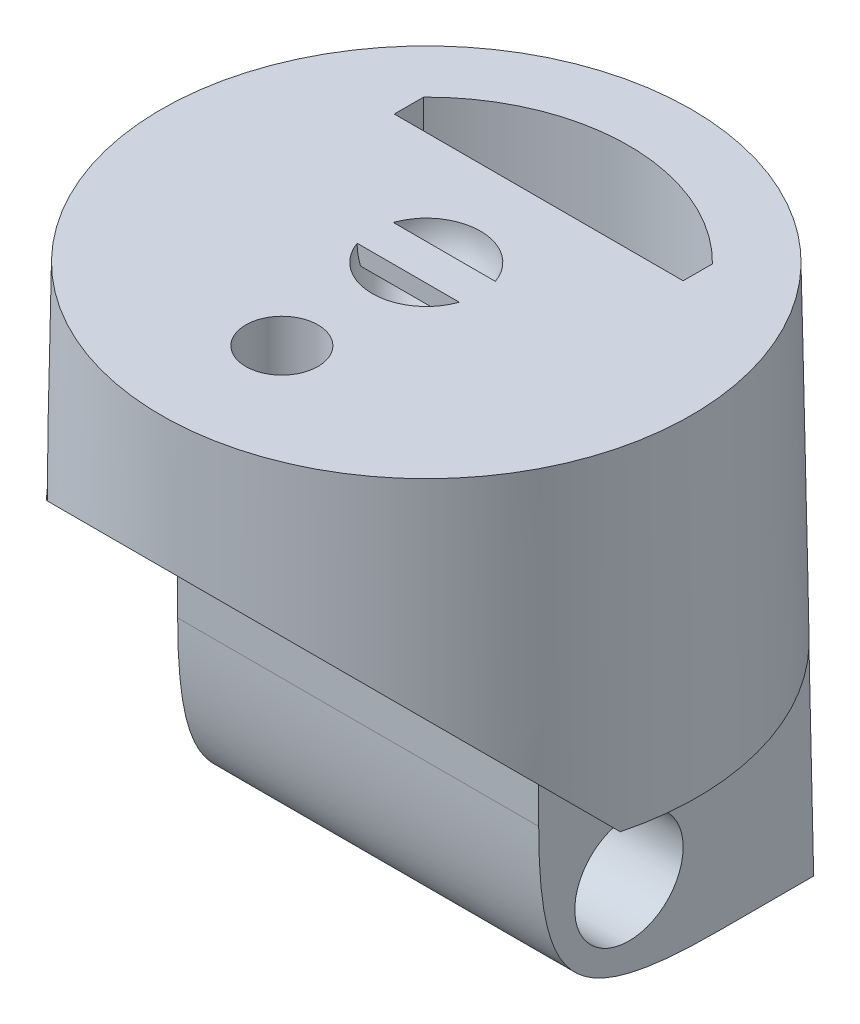
ISO-10303-21;
HEADER;
FILE_DESCRIPTION(('STEP AP214'),'2;1');
FILE_NAME('part.step','',(''),(''),'','','');
FILE_SCHEMA(('AUTOMOTIVE_DESIGN { 1 0 10303 214 1 1 1 1 }'));
ENDSEC;
DATA;
#1=APPLICATION_CONTEXT('core data for automotive mechanical design processes');
#2=APPLICATION_PROTOCOL_DEFINITION('international standard','automotive_design',2000,#1);
#3=PRODUCT_CONTEXT('',#1,'mechanical');
#4=PRODUCT('Part','Part','',(#3));
#5=PRODUCT_RELATED_PRODUCT_CATEGORY('part','',(#4));
#6=PRODUCT_DEFINITION_FORMATION('','',#4);
#7=PRODUCT_DEFINITION_CONTEXT('part definition',#1,'design');
#8=PRODUCT_DEFINITION('design','',#6,#7);
#9=PRODUCT_DEFINITION_SHAPE('','',#8);
#10=(LENGTH_UNIT() NAMED_UNIT(*) SI_UNIT(.MILLI.,.METRE.));
#11=(NAMED_UNIT(*) PLANE_ANGLE_UNIT() SI_UNIT($,.RADIAN.));
#12=(NAMED_UNIT(*) SI_UNIT($,.STERADIAN.) SOLID_ANGLE_UNIT());
#13=UNCERTAINTY_MEASURE_WITH_UNIT(LENGTH_MEASURE(1.E-05),#10,'distance_accuracy_value','');
#14=(GEOMETRIC_REPRESENTATION_CONTEXT(3) GLOBAL_UNCERTAINTY_ASSIGNED_CONTEXT((#13)) GLOBAL_UNIT_ASSIGNED_CONTEXT((#10,
#11,#12)) REPRESENTATION_CONTEXT('',''));
#15=CARTESIAN_POINT('',(0.,0.,0.));
#16=DIRECTION('',(0.,0.,1.));
#17=DIRECTION('',(1.,0.,0.));
#18=AXIS2_PLACEMENT_3D('',#15,#16,#17);
#19=CARTESIAN_POINT('',(0.,9.08726369937621,0.));
#20=DIRECTION('',(-1.,0.,0.));
#21=DIRECTION('',(0.,0.,-1.));
#22=AXIS2_PLACEMENT_3D('',#19,#20,#21);
#23=SPHERICAL_SURFACE('',#22,1.5);
#24=CARTESIAN_POINT('',(0.,8.58726369937621,0.));
#25=DIRECTION('',(0.,1.,0.));
#26=DIRECTION('',(0.,0.,1.));
#27=AXIS2_PLACEMENT_3D('',#24,#25,#26);
#28=CIRCLE('',#27,1.4142135623731);
#29=CARTESIAN_POINT('',(1.3228756555323,8.58726369937621,0.5));
#30=VERTEX_POINT('',#29);
#31=CARTESIAN_POINT('',(1.3228756555323,8.58726369937621,-0.5));
#32=VERTEX_POINT('',#31);
#33=EDGE_CURVE('E67',#30,#32,#28,.T.);
#34=ORIENTED_EDGE('',*,*,#33,.T.);
#35=CARTESIAN_POINT('',(0.,9.08726369937621,-0.5));
#36=DIRECTION('',(0.,0.,1.));
#37=DIRECTION('',(1.,0.,0.));
#38=AXIS2_PLACEMENT_3D('',#35,#36,#37);
#39=CIRCLE('',#38,1.4142135623731);
#40=CARTESIAN_POINT('',(1.4142135623731,9.08726369937621,-0.5));
#41=VERTEX_POINT('',#40);
#42=EDGE_CURVE('E13',#32,#41,#39,.T.);
#43=ORIENTED_EDGE('',*,*,#42,.T.);
#44=CARTESIAN_POINT('',(0.,9.08726369937621,0.));
#45=DIRECTION('',(0.,-1.,0.));
#46=DIRECTION('',(0.,0.,-1.));
#47=AXIS2_PLACEMENT_3D('',#44,#45,#46);
#48=CIRCLE('',#47,1.5);
#49=CARTESIAN_POINT('',(-1.4142135623731,9.08726369937621,-0.5));
#50=VERTEX_POINT('',#49);
#51=EDGE_CURVE('E157',#41,#50,#48,.F.);
#52=ORIENTED_EDGE('',*,*,#51,.T.);
#53=CARTESIAN_POINT('',(-1.3228756555323,8.58726369937621,-0.5));
#54=VERTEX_POINT('',#53);
#55=EDGE_CURVE('E56',#50,#54,#39,.T.);
#56=ORIENTED_EDGE('',*,*,#55,.T.);
#57=CARTESIAN_POINT('',(-1.3228756555323,8.58726369937621,0.5));
#58=VERTEX_POINT('',#57);
#59=EDGE_CURVE('E162',#54,#58,#28,.T.);
#60=ORIENTED_EDGE('',*,*,#59,.T.);
#61=CARTESIAN_POINT('',(0.,9.08726369937621,0.5));
#62=DIRECTION('',(0.,0.,1.));
#63=DIRECTION('',(1.,0.,0.));
#64=AXIS2_PLACEMENT_3D('',#61,#62,#63);
#65=CIRCLE('',#64,1.4142135623731);
#66=CARTESIAN_POINT('',(-1.4142135623731,9.08726369937621,0.5));
#67=VERTEX_POINT('',#66);
#68=EDGE_CURVE('E160',#67,#58,#65,.T.);
#69=ORIENTED_EDGE('',*,*,#68,.F.);
#70=CARTESIAN_POINT('',(1.4142135623731,9.08726369937621,0.5));
#71=VERTEX_POINT('',#70);
#72=EDGE_CURVE('E150',#67,#71,#48,.F.);
#73=ORIENTED_EDGE('',*,*,#72,.T.);
#74=EDGE_CURVE('E61',#30,#71,#65,.T.);
#75=ORIENTED_EDGE('',*,*,#74,.F.);
#76=EDGE_LOOP('',(#34,#43,#52,#56,#60,#69,#73,#75));
#77=FACE_BOUND('',#76,.T.);
#78=ADVANCED_FACE('F48',(#77),#23,.F.);
#79=CARTESIAN_POINT('',(0.,0.,0.));
#80=DIRECTION('',(0.,-1.,0.));
#81=DIRECTION('',(0.,0.,1.));
#82=AXIS2_PLACEMENT_3D('',#79,#80,#81);
#83=CONICAL_SURFACE('',#82,7.5,0.0174532925199434);
#84=CARTESIAN_POINT('',(0.,9.08726369937621,0.));
#85=DIRECTION('',(0.,-1.,0.));
#86=DIRECTION('',(0.,0.,-1.));
#87=AXIS2_PLACEMENT_3D('',#84,#85,#86);
#88=CIRCLE('',#87,7.34138122210755);
#89=CARTESIAN_POINT('',(0.,9.08726369937621,-7.34138122210755));
#90=VERTEX_POINT('',#89);
#91=EDGE_CURVE('E198',#90,#90,#88,.F.);
#92=ORIENTED_EDGE('',*,*,#91,.F.);
#93=EDGE_LOOP('',(#92));
#94=FACE_BOUND('',#93,.T.);
#95=CARTESIAN_POINT('',(0.,0.,0.));
#96=DIRECTION('',(0.,1.,0.));
#97=DIRECTION('',(0.,0.,1.));
#98=AXIS2_PLACEMENT_3D('',#95,#96,#97);
#99=CIRCLE('',#98,7.5);
#100=CARTESIAN_POINT('',(5.,0.,-5.59016994374948));
#101=VERTEX_POINT('',#100);
#102=CARTESIAN_POINT('',(7.25897968705128,0.,1.88605776766695));
#103=VERTEX_POINT('',#102);
#104=EDGE_CURVE('E489',#101,#103,#99,.F.);
#105=ORIENTED_EDGE('',*,*,#104,.F.);
#106=CARTESIAN_POINT('',(5.,10.3775407591745,-5.34468916009784));
#107=CARTESIAN_POINT('',(5.,7.89530710809119,-5.40401868693817));
#108=CARTESIAN_POINT('',(5.,5.41306256433035,-5.46289130191557));
#109=CARTESIAN_POINT('',(5.,0.448553998900634,-5.57979955803964));
#110=CARTESIAN_POINT('',(5.,-2.03371002276637,-5.63783519926591));
#111=CARTESIAN_POINT('',(5.,-6.99825566920806,-5.7531463681212));
#112=CARTESIAN_POINT('',(5.,-9.48053729398247,-5.81042189576228));
#113=CARTESIAN_POINT('',(5.,-14.445116775284,-5.92427558863006));
#114=CARTESIAN_POINT('',(5.,-16.9274146318126,-5.98085375379047));
#115=CARTESIAN_POINT('',(5.,-19.4097196629107,-6.03711460739748));
#116=B_SPLINE_CURVE_WITH_KNOTS('',3,(#106,#107,#108,#109,#110,#111,#112,#113,#114,#115),
.UNSPECIFIED.,.F.,.F.,(4,2,2,2,4),(0.,7.44882767880741,14.8976546493633,22.3464815017265,
29.795309062088),.UNSPECIFIED.);
#117=CARTESIAN_POINT('',(5.,-6.,-5.72991485958028));
#118=VERTEX_POINT('',#117);
#119=EDGE_CURVE('E379',#101,#118,#116,.T.);
#120=ORIENTED_EDGE('',*,*,#119,.T.);
#121=CARTESIAN_POINT('',(0.,-6.,0.));
#122=DIRECTION('',(0.,1.,0.));
#123=DIRECTION('',(0.,0.,1.));
#124=AXIS2_PLACEMENT_3D('',#121,#122,#123);
#125=CIRCLE('',#124,7.60473038956931);
#126=CARTESIAN_POINT('',(-5.,-6.,-5.72991485958028));
#127=VERTEX_POINT('',#126);
#128=EDGE_CURVE('E428',#118,#127,#125,.T.);
#129=ORIENTED_EDGE('',*,*,#128,.T.);
#130=CARTESIAN_POINT('',(-5.,10.3775407591745,-5.34468916009784));
#131=CARTESIAN_POINT('',(-5.,7.89530710809119,-5.40401868693817));
#132=CARTESIAN_POINT('',(-5.,5.41306256433035,-5.46289130191556));
#133=CARTESIAN_POINT('',(-5.,0.448553998900639,-5.57979955803964));
#134=CARTESIAN_POINT('',(-5.,-2.03371002276637,-5.63783519926591));
#135=CARTESIAN_POINT('',(-5.,-6.99825566920806,-5.7531463681212));
#136=CARTESIAN_POINT('',(-5.,-9.48053729398246,-5.81042189576228));
#137=CARTESIAN_POINT('',(-5.,-14.445116775284,-5.92427558863006));
#138=CARTESIAN_POINT('',(-5.,-16.9274146318126,-5.98085375379047));
#139=CARTESIAN_POINT('',(-5.,-19.4097196629107,-6.03711460739748));
#140=B_SPLINE_CURVE_WITH_KNOTS('',3,(#130,#131,#132,#133,#134,#135,#136,#137,#138,#139),
.UNSPECIFIED.,.F.,.F.,(4,2,2,2,4),(0.,7.4488276788074,14.8976546493633,22.3464815017265,
29.795309062088),.UNSPECIFIED.);
#141=CARTESIAN_POINT('',(-5.,0.,-5.59016994374947));
#142=VERTEX_POINT('',#141);
#143=EDGE_CURVE('E407',#142,#127,#140,.T.);
#144=ORIENTED_EDGE('',*,*,#143,.F.);
#145=CARTESIAN_POINT('',(0.,0.,0.));
#146=DIRECTION('',(0.,-1.,0.));
#147=DIRECTION('',(0.,0.,-1.));
#148=AXIS2_PLACEMENT_3D('',#145,#146,#147);
#149=CIRCLE('',#148,7.5);
#150=CARTESIAN_POINT('',(-7.25897968705128,0.,1.88605776766695));
#151=VERTEX_POINT('',#150);
#152=EDGE_CURVE('E421',#142,#151,#149,.F.);
#153=ORIENTED_EDGE('',*,*,#152,.T.);
#154=CARTESIAN_POINT('',(0.,-2.01758547114077,-0.131527703473819));
#155=DIRECTION('',(0.,0.707106781186549,-0.707106781186546));
#156=DIRECTION('',(0.,-0.707106781186546,-0.707106781186549));
#157=AXIS2_PLACEMENT_3D('',#154,#155,#156);
#158=ELLIPSE('',#157,10.6564061975939,7.53406908564539);
#159=EDGE_CURVE('E430',#103,#151,#158,.F.);
#160=ORIENTED_EDGE('',*,*,#159,.F.);
#161=EDGE_LOOP('',(#105,#120,#129,#144,#153,#160));
#162=FACE_BOUND('',#161,.T.);
#163=ADVANCED_FACE('F240',(#94,#162),#83,.T.);
#164=CARTESIAN_POINT('',(0.,-6.,0.));
#165=DIRECTION('',(0.,1.,0.));
#166=DIRECTION('',(0.,0.,1.));
#167=AXIS2_PLACEMENT_3D('',#164,#165,#166);
#168=PLANE('',#167);
#169=CARTESIAN_POINT('',(-5.5,-6.,-3.11394223233305));
#170=CARTESIAN_POINT('',(-1.83333333333334,-6.,-3.11394223233305));
#171=CARTESIAN_POINT('',(1.83333333333333,-6.,-3.11394223233305));
#172=CARTESIAN_POINT('',(5.5,-6.,-3.11394223233305));
#173=(BOUNDED_CURVE() B_SPLINE_CURVE(3,(#169,#170,#171,#172),.UNSPECIFIED.,.F.,
.F.) B_SPLINE_CURVE_WITH_KNOTS((4,4),(-0.0055,0.0055),
.UNSPECIFIED.) CURVE() GEOMETRIC_REPRESENTATION_ITEM() RATIONAL_B_SPLINE_CURVE((1.,1.,1.,1.)) REPRESENTATION_ITEM(''));
#174=CARTESIAN_POINT('',(5.,-6.,-3.11394223233305));
#175=VERTEX_POINT('',#174);
#176=CARTESIAN_POINT('',(4.,-6.,-3.11394223233305));
#177=VERTEX_POINT('',#176);
#178=EDGE_CURVE('E402',#175,#177,#173,.F.);
#179=ORIENTED_EDGE('',*,*,#178,.T.);
#180=DIRECTION('',(0.,0.,1.));
#181=VECTOR('',#180,1.);
#182=CARTESIAN_POINT('',(4.,-6.,-3.11394223233305));
#183=LINE('',#182,#181);
#184=CARTESIAN_POINT('',(4.,-6.,-3.92593972696496));
#185=VERTEX_POINT('',#184);
#186=EDGE_CURVE('E186',#185,#177,#183,.T.);
#187=ORIENTED_EDGE('',*,*,#186,.F.);
#188=CARTESIAN_POINT('',(0.,-6.,0.));
#189=DIRECTION('',(0.,-1.,0.));
#190=DIRECTION('',(0.,0.,-1.));
#191=AXIS2_PLACEMENT_3D('',#188,#189,#190);
#192=CIRCLE('',#191,5.60473038956931);
#193=CARTESIAN_POINT('',(-4.,-6.,-3.92593972696496));
#194=VERTEX_POINT('',#193);
#195=EDGE_CURVE('E183',#194,#185,#192,.T.);
#196=ORIENTED_EDGE('',*,*,#195,.F.);
#197=DIRECTION('',(0.,0.,-1.));
#198=VECTOR('',#197,1.);
#199=CARTESIAN_POINT('',(-4.,-6.,-3.11394223233305));
#200=LINE('',#199,#198);
#201=CARTESIAN_POINT('',(-4.,-6.,-3.11394223233305));
#202=VERTEX_POINT('',#201);
#203=EDGE_CURVE('E187',#202,#194,#200,.T.);
#204=ORIENTED_EDGE('',*,*,#203,.F.);
#205=CARTESIAN_POINT('',(-5.5,-6.,-3.11394223233305));
#206=CARTESIAN_POINT('',(-1.83333333333334,-6.,-3.11394223233305));
#207=CARTESIAN_POINT('',(1.83333333333333,-6.,-3.11394223233305));
#208=CARTESIAN_POINT('',(5.5,-6.,-3.11394223233305));
#209=(BOUNDED_CURVE() B_SPLINE_CURVE(3,(#205,#206,#207,#208),.UNSPECIFIED.,.F.,
.F.) B_SPLINE_CURVE_WITH_KNOTS((4,4),(-0.0055,0.0055),
.UNSPECIFIED.) CURVE() GEOMETRIC_REPRESENTATION_ITEM() RATIONAL_B_SPLINE_CURVE((1.,1.,1.,1.)) REPRESENTATION_ITEM(''));
#210=CARTESIAN_POINT('',(-5.,-6.,-3.11394223233305));
#211=VERTEX_POINT('',#210);
#212=EDGE_CURVE('E264',#202,#211,#209,.F.);
#213=ORIENTED_EDGE('',*,*,#212,.T.);
#214=DIRECTION('',(0.,0.,1.));
#215=VECTOR('',#214,1.);
#216=CARTESIAN_POINT('',(-5.,-6.,-7.6047303895693));
#217=LINE('',#216,#215);
#218=EDGE_CURVE('E404',#127,#211,#217,.T.);
#219=ORIENTED_EDGE('',*,*,#218,.F.);
#220=ORIENTED_EDGE('',*,*,#128,.F.);
#221=DIRECTION('',(0.,0.,1.));
#222=VECTOR('',#221,1.);
#223=CARTESIAN_POINT('',(5.,-6.,-7.6047303895693));
#224=LINE('',#223,#222);
#225=EDGE_CURVE('E209',#118,#175,#224,.T.);
#226=ORIENTED_EDGE('',*,*,#225,.T.);
#227=EDGE_LOOP('',(#179,#187,#196,#204,#213,#219,#220,#226));
#228=FACE_BOUND('',#227,.T.);
#229=ADVANCED_FACE('F236',(#228),#168,.F.);
#230=CARTESIAN_POINT('',(-7.60473038956931,-6.,1.88605776766695));
#231=DIRECTION('',(0.,0.,-1.));
#232=DIRECTION('',(-1.,0.,0.));
#233=AXIS2_PLACEMENT_3D('',#230,#231,#232);
#234=PLANE('',#233);
#235=DIRECTION('',(0.,1.,0.));
#236=VECTOR('',#235,1.);
#237=CARTESIAN_POINT('',(-5.,0.,1.88605776766695));
#238=LINE('',#237,#236);
#239=CARTESIAN_POINT('',(-5.,-1.,1.88605776766695));
#240=VERTEX_POINT('',#239);
#241=CARTESIAN_POINT('',(-5.,0.,1.88605776766695));
#242=VERTEX_POINT('',#241);
#243=EDGE_CURVE('E250',#240,#242,#238,.T.);
#244=ORIENTED_EDGE('',*,*,#243,.F.);
#245=CARTESIAN_POINT('',(5.5,-1.,1.88605776766695));
#246=CARTESIAN_POINT('',(1.83333333333333,-1.,1.88605776766695));
#247=CARTESIAN_POINT('',(-1.83333333333334,-1.,1.88605776766695));
#248=CARTESIAN_POINT('',(-5.5,-1.,1.88605776766695));
#249=(BOUNDED_CURVE() B_SPLINE_CURVE(3,(#245,#246,#247,#248),.UNSPECIFIED.,.F.,
.F.) B_SPLINE_CURVE_WITH_KNOTS((4,4),(-0.0055,0.0055),
.UNSPECIFIED.) CURVE() GEOMETRIC_REPRESENTATION_ITEM() RATIONAL_B_SPLINE_CURVE((1.,1.,1.,1.)) REPRESENTATION_ITEM(''));
#250=CARTESIAN_POINT('',(5.,-1.,1.88605776766695));
#251=VERTEX_POINT('',#250);
#252=EDGE_CURVE('E218',#240,#251,#249,.F.);
#253=ORIENTED_EDGE('',*,*,#252,.T.);
#254=DIRECTION('',(0.,1.,0.));
#255=VECTOR('',#254,1.);
#256=CARTESIAN_POINT('',(5.,0.,1.88605776766695));
#257=LINE('',#256,#255);
#258=CARTESIAN_POINT('',(5.,0.,1.88605776766695));
#259=VERTEX_POINT('',#258);
#260=EDGE_CURVE('E201',#251,#259,#257,.T.);
#261=ORIENTED_EDGE('',*,*,#260,.T.);
#262=DIRECTION('',(1.,0.,0.));
#263=VECTOR('',#262,1.);
#264=CARTESIAN_POINT('',(-7.60473038956931,0.,1.88605776766695));
#265=LINE('',#264,#263);
#266=EDGE_CURVE('E429',#242,#259,#265,.T.);
#267=ORIENTED_EDGE('',*,*,#266,.F.);
#268=EDGE_LOOP('',(#244,#253,#261,#267));
#269=FACE_BOUND('',#268,.T.);
#270=ADVANCED_FACE('F225',(#269),#234,.F.);
#271=CARTESIAN_POINT('',(-7.60473038956931,0.,1.88605776766695));
#272=DIRECTION('',(0.,0.707106781186549,-0.707106781186546));
#273=DIRECTION('',(0.,0.707106781186546,0.707106781186549));
#274=AXIS2_PLACEMENT_3D('',#271,#272,#273);
#275=PLANE('',#274);
#276=CARTESIAN_POINT('',(0.,2.11394223233304,4.));
#277=DIRECTION('',(0.,0.707106781186549,-0.707106781186546));
#278=DIRECTION('',(0.,0.707106781186546,0.707106781186549));
#279=AXIS2_PLACEMENT_3D('',#276,#277,#278);
#280=ELLIPSE('',#279,1.41421356237309,1.);
#281=CARTESIAN_POINT('',(0.,3.11394223233303,5.));
#282=VERTEX_POINT('',#281);
#283=EDGE_CURVE('E179',#282,#282,#280,.T.);
#284=ORIENTED_EDGE('',*,*,#283,.T.);
#285=EDGE_LOOP('',(#284));
#286=FACE_BOUND('',#285,.T.);
#287=ORIENTED_EDGE('',*,*,#159,.T.);
#288=EDGE_CURVE('E425',#151,#242,#265,.T.);
#289=ORIENTED_EDGE('',*,*,#288,.T.);
#290=ORIENTED_EDGE('',*,*,#266,.T.);
#291=EDGE_CURVE('E424',#259,#103,#265,.T.);
#292=ORIENTED_EDGE('',*,*,#291,.T.);
#293=EDGE_LOOP('',(#287,#289,#290,#292));
#294=FACE_BOUND('',#293,.T.);
#295=ADVANCED_FACE('F235',(#286,#294),#275,.F.);
#296=CARTESIAN_POINT('',(0.,0.,-7.6047303895693));
#297=DIRECTION('',(0.,-1.,0.));
#298=DIRECTION('',(0.,0.,-1.));
#299=AXIS2_PLACEMENT_3D('',#296,#297,#298);
#300=PLANE('',#299);
#301=DIRECTION('',(0.,0.,1.));
#302=VECTOR('',#301,1.);
#303=CARTESIAN_POINT('',(-5.,0.,-7.6047303895693));
#304=LINE('',#303,#302);
#305=EDGE_CURVE('E409',#142,#242,#304,.T.);
#306=ORIENTED_EDGE('',*,*,#305,.T.);
#307=ORIENTED_EDGE('',*,*,#288,.F.);
#308=ORIENTED_EDGE('',*,*,#152,.F.);
#309=EDGE_LOOP('',(#306,#307,#308));
#310=FACE_BOUND('',#309,.T.);
#311=ADVANCED_FACE('F472',(#310),#300,.T.);
#312=CARTESIAN_POINT('',(-5.,0.,-7.6047303895693));
#313=DIRECTION('',(1.,0.,0.));
#314=DIRECTION('',(0.,0.,-1.));
#315=AXIS2_PLACEMENT_3D('',#312,#313,#314);
#316=PLANE('',#315);
#317=CARTESIAN_POINT('',(-5.,-3.5,-0.613942232333046));
#318=DIRECTION('',(1.,0.,0.));
#319=DIRECTION('',(0.,0.,-1.));
#320=AXIS2_PLACEMENT_3D('',#317,#318,#319);
#321=CIRCLE('',#320,1.5);
#322=CARTESIAN_POINT('',(-5.,-3.5,-2.11394223233305));
#323=VERTEX_POINT('',#322);
#324=EDGE_CURVE('E197',#323,#323,#321,.T.);
#325=ORIENTED_EDGE('',*,*,#324,.T.);
#326=EDGE_LOOP('',(#325));
#327=FACE_BOUND('',#326,.T.);
#328=ORIENTED_EDGE('',*,*,#218,.T.);
#329=CARTESIAN_POINT('',(-5.,-1.,1.88605776766695));
#330=CARTESIAN_POINT('',(-5.,-6.,1.88605776766695));
#331=CARTESIAN_POINT('',(-5.,-6.,-3.11394223233305));
#332=(BOUNDED_CURVE() B_SPLINE_CURVE(2,(#329,#330,#331),.UNSPECIFIED.,.F.,
.F.) B_SPLINE_CURVE_WITH_KNOTS((3,3),(0.,1.),
.UNSPECIFIED.) CURVE() GEOMETRIC_REPRESENTATION_ITEM() RATIONAL_B_SPLINE_CURVE((1.,1.5,1.)) REPRESENTATION_ITEM(''));
#333=EDGE_CURVE('E392',#211,#240,#332,.F.);
#334=ORIENTED_EDGE('',*,*,#333,.T.);
#335=ORIENTED_EDGE('',*,*,#243,.T.);
#336=ORIENTED_EDGE('',*,*,#305,.F.);
#337=ORIENTED_EDGE('',*,*,#143,.T.);
#338=EDGE_LOOP('',(#328,#334,#335,#336,#337));
#339=FACE_BOUND('',#338,.T.);
#340=ADVANCED_FACE('F374',(#327,#339),#316,.F.);
#341=CARTESIAN_POINT('',(5.,0.,-7.6047303895693));
#342=DIRECTION('',(1.,0.,0.));
#343=DIRECTION('',(0.,0.,-1.));
#344=AXIS2_PLACEMENT_3D('',#341,#342,#343);
#345=PLANE('',#344);
#346=CARTESIAN_POINT('',(5.,-3.5,-0.613942232333046));
#347=DIRECTION('',(1.,0.,0.));
#348=DIRECTION('',(0.,0.,-1.));
#349=AXIS2_PLACEMENT_3D('',#346,#347,#348);
#350=CIRCLE('',#349,1.5);
#351=CARTESIAN_POINT('',(5.,-3.5,-2.11394223233305));
#352=VERTEX_POINT('',#351);
#353=EDGE_CURVE('E194',#352,#352,#350,.T.);
#354=ORIENTED_EDGE('',*,*,#353,.F.);
#355=EDGE_LOOP('',(#354));
#356=FACE_BOUND('',#355,.T.);
#357=ORIENTED_EDGE('',*,*,#260,.F.);
#358=CARTESIAN_POINT('',(5.,-6.,-3.11394223233305));
#359=CARTESIAN_POINT('',(5.,-6.,1.88605776766695));
#360=CARTESIAN_POINT('',(5.,-1.,1.88605776766695));
#361=(BOUNDED_CURVE() B_SPLINE_CURVE(2,(#358,#359,#360),.UNSPECIFIED.,.F.,
.F.) B_SPLINE_CURVE_WITH_KNOTS((3,3),(0.,1.),
.UNSPECIFIED.) CURVE() GEOMETRIC_REPRESENTATION_ITEM() RATIONAL_B_SPLINE_CURVE((1.,1.5,1.)) REPRESENTATION_ITEM(''));
#362=EDGE_CURVE('E287',#251,#175,#361,.F.);
#363=ORIENTED_EDGE('',*,*,#362,.T.);
#364=ORIENTED_EDGE('',*,*,#225,.F.);
#365=ORIENTED_EDGE('',*,*,#119,.F.);
#366=DIRECTION('',(0.,0.,1.));
#367=VECTOR('',#366,1.);
#368=CARTESIAN_POINT('',(5.,0.,-7.6047303895693));
#369=LINE('',#368,#367);
#370=EDGE_CURVE('E204',#101,#259,#369,.T.);
#371=ORIENTED_EDGE('',*,*,#370,.T.);
#372=EDGE_LOOP('',(#357,#363,#364,#365,#371));
#373=FACE_BOUND('',#372,.T.);
#374=ADVANCED_FACE('F370',(#356,#373),#345,.T.);
#375=CARTESIAN_POINT('',(0.,0.,-7.6047303895693));
#376=DIRECTION('',(0.,1.,0.));
#377=DIRECTION('',(0.,0.,1.));
#378=AXIS2_PLACEMENT_3D('',#375,#376,#377);
#379=PLANE('',#378);
#380=ORIENTED_EDGE('',*,*,#104,.T.);
#381=ORIENTED_EDGE('',*,*,#291,.F.);
#382=ORIENTED_EDGE('',*,*,#370,.F.);
#383=EDGE_LOOP('',(#380,#381,#382));
#384=FACE_BOUND('',#383,.T.);
#385=ADVANCED_FACE('F366',(#384),#379,.F.);
#386=CARTESIAN_POINT('',(-7.5,-3.5,-0.613942232333046));
#387=DIRECTION('',(1.,0.,0.));
#388=DIRECTION('',(0.,0.,-1.));
#389=AXIS2_PLACEMENT_3D('',#386,#387,#388);
#390=CYLINDRICAL_SURFACE('',#389,1.5);
#391=CARTESIAN_POINT('',(5.,-3.5,-2.11394223233305));
#392=CARTESIAN_POINT('',(4.89583333333333,-3.5,-2.11394223233305));
#393=CARTESIAN_POINT('',(4.79166666666667,-3.5,-2.11394223233305));
#394=CARTESIAN_POINT('',(4.58333333333333,-3.5,-2.11394223233305));
#395=CARTESIAN_POINT('',(4.47916666666667,-3.5,-2.11394223233305));
#396=CARTESIAN_POINT('',(4.27083333333333,-3.5,-2.11394223233305));
#397=CARTESIAN_POINT('',(4.16666666666667,-3.5,-2.11394223233305));
#398=CARTESIAN_POINT('',(3.95833333333333,-3.5,-2.11394223233305));
#399=CARTESIAN_POINT('',(3.85416666666667,-3.5,-2.11394223233305));
#400=CARTESIAN_POINT('',(3.64583333333333,-3.5,-2.11394223233305));
#401=CARTESIAN_POINT('',(3.54166666666667,-3.5,-2.11394223233305));
#402=CARTESIAN_POINT('',(3.33333333333333,-3.5,-2.11394223233305));
#403=CARTESIAN_POINT('',(3.22916666666667,-3.5,-2.11394223233305));
#404=CARTESIAN_POINT('',(3.02083333333333,-3.5,-2.11394223233305));
#405=CARTESIAN_POINT('',(2.91666666666667,-3.5,-2.11394223233305));
#406=CARTESIAN_POINT('',(2.70833333333333,-3.5,-2.11394223233305));
#407=CARTESIAN_POINT('',(2.60416666666667,-3.5,-2.11394223233305));
#408=CARTESIAN_POINT('',(2.39583333333333,-3.5,-2.11394223233305));
#409=CARTESIAN_POINT('',(2.29166666666667,-3.5,-2.11394223233305));
#410=CARTESIAN_POINT('',(2.08333333333333,-3.5,-2.11394223233305));
#411=CARTESIAN_POINT('',(1.97916666666667,-3.5,-2.11394223233305));
#412=CARTESIAN_POINT('',(1.77083333333333,-3.5,-2.11394223233305));
#413=CARTESIAN_POINT('',(1.66666666666667,-3.5,-2.11394223233305));
#414=CARTESIAN_POINT('',(1.45833333333333,-3.5,-2.11394223233305));
#415=CARTESIAN_POINT('',(1.35416666666667,-3.5,-2.11394223233305));
#416=CARTESIAN_POINT('',(1.14583333333333,-3.5,-2.11394223233305));
#417=CARTESIAN_POINT('',(1.04166666666667,-3.5,-2.11394223233305));
#418=CARTESIAN_POINT('',(0.833333333333332,-3.5,-2.11394223233305));
#419=CARTESIAN_POINT('',(0.729166666666666,-3.5,-2.11394223233305));
#420=CARTESIAN_POINT('',(0.520833333333332,-3.5,-2.11394223233305));
#421=CARTESIAN_POINT('',(0.416666666666666,-3.5,-2.11394223233305));
#422=CARTESIAN_POINT('',(0.208333333333333,-3.5,-2.11394223233305));
#423=CARTESIAN_POINT('',(0.104166666666666,-3.5,-2.11394223233305));
#424=CARTESIAN_POINT('',(-0.104166666666668,-3.5,-2.11394223233305));
#425=CARTESIAN_POINT('',(-0.208333333333334,-3.5,-2.11394223233305));
#426=CARTESIAN_POINT('',(-0.416666666666668,-3.5,-2.11394223233305));
#427=CARTESIAN_POINT('',(-0.520833333333335,-3.5,-2.11394223233305));
#428=CARTESIAN_POINT('',(-0.729166666666668,-3.5,-2.11394223233305));
#429=CARTESIAN_POINT('',(-0.833333333333334,-3.5,-2.11394223233305));
#430=CARTESIAN_POINT('',(-1.04166666666667,-3.5,-2.11394223233305));
#431=CARTESIAN_POINT('',(-1.14583333333333,-3.5,-2.11394223233305));
#432=CARTESIAN_POINT('',(-1.35416666666667,-3.5,-2.11394223233305));
#433=CARTESIAN_POINT('',(-1.45833333333333,-3.5,-2.11394223233305));
#434=CARTESIAN_POINT('',(-1.66666666666667,-3.5,-2.11394223233305));
#435=CARTESIAN_POINT('',(-1.77083333333333,-3.5,-2.11394223233305));
#436=CARTESIAN_POINT('',(-1.97916666666667,-3.5,-2.11394223233305));
#437=CARTESIAN_POINT('',(-2.08333333333333,-3.5,-2.11394223233305));
#438=CARTESIAN_POINT('',(-2.29166666666667,-3.5,-2.11394223233305));
#439=CARTESIAN_POINT('',(-2.39583333333333,-3.5,-2.11394223233305));
#440=CARTESIAN_POINT('',(-2.60416666666667,-3.5,-2.11394223233305));
#441=CARTESIAN_POINT('',(-2.70833333333333,-3.5,-2.11394223233305));
#442=CARTESIAN_POINT('',(-2.91666666666667,-3.5,-2.11394223233305));
#443=CARTESIAN_POINT('',(-3.02083333333333,-3.5,-2.11394223233305));
#444=CARTESIAN_POINT('',(-3.22916666666667,-3.5,-2.11394223233305));
#445=CARTESIAN_POINT('',(-3.33333333333334,-3.5,-2.11394223233305));
#446=CARTESIAN_POINT('',(-3.54166666666667,-3.5,-2.11394223233305));
#447=CARTESIAN_POINT('',(-3.64583333333333,-3.5,-2.11394223233305));
#448=CARTESIAN_POINT('',(-3.85416666666667,-3.5,-2.11394223233305));
#449=CARTESIAN_POINT('',(-3.95833333333333,-3.5,-2.11394223233305));
#450=CARTESIAN_POINT('',(-4.16666666666667,-3.5,-2.11394223233305));
#451=CARTESIAN_POINT('',(-4.27083333333333,-3.5,-2.11394223233305));
#452=CARTESIAN_POINT('',(-4.47916666666667,-3.5,-2.11394223233305));
#453=CARTESIAN_POINT('',(-4.58333333333333,-3.5,-2.11394223233305));
#454=CARTESIAN_POINT('',(-4.79166666666667,-3.5,-2.11394223233305));
#455=CARTESIAN_POINT('',(-4.89583333333333,-3.5,-2.11394223233305));
#456=CARTESIAN_POINT('',(-5.,-3.5,-2.11394223233305));
#457=B_SPLINE_CURVE_WITH_KNOTS('',3,(#391,#392,#393,#394,#395,#396,#397,#398,#399,#400,#401,
#402,#403,#404,#405,#406,#407,#408,#409,#410,#411,#412,#413,#414,#415,#416,#417,#418,#419,#420,
#421,#422,#423,#424,#425,#426,#427,#428,#429,#430,#431,#432,#433,#434,#435,#436,#437,#438,#439,
#440,#441,#442,#443,#444,#445,#446,#447,#448,#449,#450,#451,#452,#453,#454,#455,#456),
.UNSPECIFIED.,.F.,.F.,(4,2,2,2,2,2,2,2,2,2,2,2,2,2,2,2,2,2,2,2,2,2,2,2,2,2,2,2,2,2,2,2,4),(0.,
0.3125,0.625000000000001,0.937500000000001,1.25,1.5625,1.875,2.1875,2.5,2.8125,3.125,3.4375,
3.75,4.0625,4.375,4.6875,5.,5.3125,5.625,5.9375,6.25,6.5625,6.875,7.1875,7.5,7.8125,8.125,
8.4375,8.75,9.0625,9.375,9.6875,10.),.UNSPECIFIED.);
#458=EDGE_CURVE('BSEAM363',#352,#323,#457,.T.);
#459=ORIENTED_EDGE('',*,*,#353,.T.);
#460=ORIENTED_EDGE('',*,*,#324,.F.);
#461=ORIENTED_EDGE('',*,*,#458,.T.);
#462=ORIENTED_EDGE('',*,*,#458,.F.);
#463=EDGE_LOOP('',(#459,#461,#460,#462));
#464=FACE_BOUND('',#463,.T.);
#465=ADVANCED_FACE('F363',(#464),#390,.F.);
#466=CARTESIAN_POINT('',(5.5,-6.,-3.11394223233305));
#467=CARTESIAN_POINT('',(1.83333333333333,-6.,-3.11394223233305));
#468=CARTESIAN_POINT('',(-1.83333333333334,-6.,-3.11394223233305));
#469=CARTESIAN_POINT('',(-5.5,-6.,-3.11394223233305));
#470=CARTESIAN_POINT('',(5.5,-6.,1.88605776766695));
#471=CARTESIAN_POINT('',(1.83333333333333,-6.,1.88605776766695));
#472=CARTESIAN_POINT('',(-1.83333333333334,-6.,1.88605776766695));
#473=CARTESIAN_POINT('',(-5.5,-6.,1.88605776766695));
#474=CARTESIAN_POINT('',(5.5,-1.,1.88605776766695));
#475=CARTESIAN_POINT('',(1.83333333333333,-1.,1.88605776766695));
#476=CARTESIAN_POINT('',(-1.83333333333334,-1.,1.88605776766695));
#477=CARTESIAN_POINT('',(-5.5,-1.,1.88605776766695));
#478=(BOUNDED_SURFACE() B_SPLINE_SURFACE(2,3,((#466,#467,#468,#469),(#470,#471,#472,#473),(#474,
#475,#476,#477)),.UNSPECIFIED.,.F.,.F.,.F.) B_SPLINE_SURFACE_WITH_KNOTS((3,3),(4,4),(0.,1.),
(-0.0055,0.0055),.UNSPECIFIED.) GEOMETRIC_REPRESENTATION_ITEM() RATIONAL_B_SPLINE_SURFACE(((1.,
1.,1.,1.),(1.5,1.5,1.5,1.5),(1.,1.,1.,1.))) REPRESENTATION_ITEM('') SURFACE());
#479=CARTESIAN_POINT('',(-5.5,-6.,-3.11394223233305));
#480=CARTESIAN_POINT('',(-1.83333333333334,-6.,-3.11394223233305));
#481=CARTESIAN_POINT('',(1.83333333333333,-6.,-3.11394223233305));
#482=CARTESIAN_POINT('',(5.5,-6.,-3.11394223233305));
#483=(BOUNDED_CURVE() B_SPLINE_CURVE(3,(#479,#480,#481,#482),.UNSPECIFIED.,.F.,
.F.) B_SPLINE_CURVE_WITH_KNOTS((4,4),(-0.0055,0.0055),
.UNSPECIFIED.) CURVE() GEOMETRIC_REPRESENTATION_ITEM() RATIONAL_B_SPLINE_CURVE((1.,1.,1.,1.)) REPRESENTATION_ITEM(''));
#484=EDGE_CURVE('E182',#177,#202,#483,.F.);
#485=ORIENTED_EDGE('',*,*,#362,.F.);
#486=ORIENTED_EDGE('',*,*,#252,.F.);
#487=ORIENTED_EDGE('',*,*,#333,.F.);
#488=ORIENTED_EDGE('',*,*,#212,.F.);
#489=ORIENTED_EDGE('',*,*,#484,.F.);
#490=ORIENTED_EDGE('',*,*,#178,.F.);
#491=EDGE_LOOP('',(#485,#486,#487,#488,#489,#490));
#492=FACE_BOUND('',#491,.T.);
#493=ADVANCED_FACE('F51',(#492),#478,.T.);
#494=CARTESIAN_POINT('',(-7.5,9.08726369937621,10.4928855515602));
#495=DIRECTION('',(0.,-1.,0.));
#496=DIRECTION('',(0.,0.,-1.));
#497=AXIS2_PLACEMENT_3D('',#494,#495,#496);
#498=PLANE('',#497);
#499=DIRECTION('',(1.,0.,0.));
#500=VECTOR('',#499,1.);
#501=CARTESIAN_POINT('',(0.,9.08726369937621,0.5));
#502=LINE('',#501,#500);
#503=EDGE_CURVE('E155',#67,#71,#502,.T.);
#504=ORIENTED_EDGE('',*,*,#503,.T.);
#505=ORIENTED_EDGE('',*,*,#72,.F.);
#506=EDGE_LOOP('',(#504,#505));
#507=FACE_BOUND('',#506,.T.);
#508=ORIENTED_EDGE('',*,*,#51,.F.);
#509=DIRECTION('',(1.,0.,0.));
#510=VECTOR('',#509,1.);
#511=CARTESIAN_POINT('',(0.,9.08726369937621,-0.5));
#512=LINE('',#511,#510);
#513=EDGE_CURVE('E168',#50,#41,#512,.T.);
#514=ORIENTED_EDGE('',*,*,#513,.F.);
#515=EDGE_LOOP('',(#508,#514));
#516=FACE_BOUND('',#515,.T.);
#517=CARTESIAN_POINT('',(0.,9.08726369937621,4.));
#518=DIRECTION('',(0.,1.,0.));
#519=DIRECTION('',(0.,0.,1.));
#520=AXIS2_PLACEMENT_3D('',#517,#518,#519);
#521=CIRCLE('',#520,1.);
#522=CARTESIAN_POINT('',(0.,9.08726369937621,5.));
#523=VERTEX_POINT('',#522);
#524=EDGE_CURVE('E156',#523,#523,#521,.T.);
#525=ORIENTED_EDGE('',*,*,#524,.F.);
#526=EDGE_LOOP('',(#525));
#527=FACE_BOUND('',#526,.T.);
#528=DIRECTION('',(0.,0.,1.));
#529=VECTOR('',#528,1.);
#530=CARTESIAN_POINT('',(3.99999999999997,9.08726369937621,10.4928855515602));
#531=LINE('',#530,#529);
#532=CARTESIAN_POINT('',(4.,9.08726369937621,-3.92593972696496));
#533=VERTEX_POINT('',#532);
#534=CARTESIAN_POINT('',(4.,9.08726369937621,-3.11394223233305));
#535=VERTEX_POINT('',#534);
#536=EDGE_CURVE('E311',#533,#535,#531,.T.);
#537=ORIENTED_EDGE('',*,*,#536,.T.);
#538=DIRECTION('',(-1.,0.,0.));
#539=VECTOR('',#538,1.);
#540=CARTESIAN_POINT('',(-7.5,9.08726369937621,-3.11394223233305));
#541=LINE('',#540,#539);
#542=CARTESIAN_POINT('',(-4.,9.08726369937621,-3.11394223233305));
#543=VERTEX_POINT('',#542);
#544=EDGE_CURVE('E313',#535,#543,#541,.T.);
#545=ORIENTED_EDGE('',*,*,#544,.T.);
#546=DIRECTION('',(0.,0.,-1.));
#547=VECTOR('',#546,1.);
#548=CARTESIAN_POINT('',(-4.00000000000003,9.08726369937621,10.4928855515602));
#549=LINE('',#548,#547);
#550=CARTESIAN_POINT('',(-4.,9.08726369937621,-3.92593972696496));
#551=VERTEX_POINT('',#550);
#552=EDGE_CURVE('E300',#543,#551,#549,.T.);
#553=ORIENTED_EDGE('',*,*,#552,.T.);
#554=CARTESIAN_POINT('',(0.,9.08726369937621,0.));
#555=DIRECTION('',(0.,-1.,0.));
#556=DIRECTION('',(0.,0.,-1.));
#557=AXIS2_PLACEMENT_3D('',#554,#555,#556);
#558=CIRCLE('',#557,5.60473038956931);
#559=EDGE_CURVE('E308',#551,#533,#558,.T.);
#560=ORIENTED_EDGE('',*,*,#559,.T.);
#561=EDGE_LOOP('',(#537,#545,#553,#560));
#562=FACE_BOUND('',#561,.T.);
#563=ORIENTED_EDGE('',*,*,#91,.T.);
#564=EDGE_LOOP('',(#563));
#565=FACE_BOUND('',#564,.T.);
#566=ADVANCED_FACE('F152',(#507,#516,#527,#562,#565),#498,.F.);
#567=CARTESIAN_POINT('',(4.,9.13726203218642,-3.11394223233305));
#568=DIRECTION('',(0.,0.,1.));
#569=DIRECTION('',(1.,0.,0.));
#570=AXIS2_PLACEMENT_3D('',#567,#568,#569);
#571=PLANE('',#570);
#572=DIRECTION('',(0.,-1.,0.));
#573=VECTOR('',#572,1.);
#574=CARTESIAN_POINT('',(4.,9.13726203218642,-3.11394223233305));
#575=LINE('',#574,#573);
#576=EDGE_CURVE('E190',#535,#177,#575,.T.);
#577=ORIENTED_EDGE('',*,*,#576,.T.);
#578=ORIENTED_EDGE('',*,*,#484,.T.);
#579=DIRECTION('',(0.,-1.,0.));
#580=VECTOR('',#579,1.);
#581=CARTESIAN_POINT('',(-4.,9.13726203218642,-3.11394223233305));
#582=LINE('',#581,#580);
#583=EDGE_CURVE('E193',#543,#202,#582,.T.);
#584=ORIENTED_EDGE('',*,*,#583,.F.);
#585=ORIENTED_EDGE('',*,*,#544,.F.);
#586=EDGE_LOOP('',(#577,#578,#584,#585));
#587=FACE_BOUND('',#586,.T.);
#588=ADVANCED_FACE('F348',(#587),#571,.F.);
#589=CARTESIAN_POINT('',(4.,9.13726203218642,-3.11394223233305));
#590=DIRECTION('',(1.,0.,0.));
#591=DIRECTION('',(0.,0.,-1.));
#592=AXIS2_PLACEMENT_3D('',#589,#590,#591);
#593=PLANE('',#592);
#594=DIRECTION('',(0.,-1.,0.));
#595=VECTOR('',#594,1.);
#596=CARTESIAN_POINT('',(4.,9.13726203218642,-3.92593972696496));
#597=LINE('',#596,#595);
#598=EDGE_CURVE('E188',#533,#185,#597,.T.);
#599=ORIENTED_EDGE('',*,*,#598,.T.);
#600=ORIENTED_EDGE('',*,*,#186,.T.);
#601=ORIENTED_EDGE('',*,*,#576,.F.);
#602=ORIENTED_EDGE('',*,*,#536,.F.);
#603=EDGE_LOOP('',(#599,#600,#601,#602));
#604=FACE_BOUND('',#603,.T.);
#605=ADVANCED_FACE('F358',(#604),#593,.F.);
#606=CARTESIAN_POINT('',(0.,9.13726203218642,0.));
#607=DIRECTION('',(0.,-1.,0.));
#608=DIRECTION('',(0.,0.,-1.));
#609=AXIS2_PLACEMENT_3D('',#606,#607,#608);
#610=CYLINDRICAL_SURFACE('',#609,5.60473038956931);
#611=DIRECTION('',(0.,-1.,0.));
#612=VECTOR('',#611,1.);
#613=CARTESIAN_POINT('',(-4.,9.13726203218642,-3.92593972696496));
#614=LINE('',#613,#612);
#615=EDGE_CURVE('E191',#551,#194,#614,.T.);
#616=ORIENTED_EDGE('',*,*,#615,.T.);
#617=ORIENTED_EDGE('',*,*,#195,.T.);
#618=ORIENTED_EDGE('',*,*,#598,.F.);
#619=ORIENTED_EDGE('',*,*,#559,.F.);
#620=EDGE_LOOP('',(#616,#617,#618,#619));
#621=FACE_BOUND('',#620,.T.);
#622=ADVANCED_FACE('F444',(#621),#610,.F.);
#623=CARTESIAN_POINT('',(-4.,9.13726203218642,-3.11394223233305));
#624=DIRECTION('',(-1.,0.,0.));
#625=DIRECTION('',(0.,0.,1.));
#626=AXIS2_PLACEMENT_3D('',#623,#624,#625);
#627=PLANE('',#626);
#628=ORIENTED_EDGE('',*,*,#583,.T.);
#629=ORIENTED_EDGE('',*,*,#203,.T.);
#630=ORIENTED_EDGE('',*,*,#615,.F.);
#631=ORIENTED_EDGE('',*,*,#552,.F.);
#632=EDGE_LOOP('',(#628,#629,#630,#631));
#633=FACE_BOUND('',#632,.T.);
#634=ADVANCED_FACE('F359',(#633),#627,.F.);
#635=CARTESIAN_POINT('',(0.,-0.912736300623791,4.));
#636=DIRECTION('',(0.,1.,0.));
#637=DIRECTION('',(0.,0.,1.));
#638=AXIS2_PLACEMENT_3D('',#635,#636,#637);
#639=CYLINDRICAL_SURFACE('',#638,1.);
#640=ORIENTED_EDGE('',*,*,#524,.T.);
#641=EDGE_LOOP('',(#640));
#642=FACE_BOUND('',#641,.T.);
#643=ORIENTED_EDGE('',*,*,#283,.F.);
#644=EDGE_LOOP('',(#643));
#645=FACE_BOUND('',#644,.T.);
#646=ADVANCED_FACE('F460',(#642,#645),#639,.F.);
#647=CARTESIAN_POINT('',(0.,8.58726369937621,-0.5));
#648=DIRECTION('',(0.,0.,1.));
#649=DIRECTION('',(1.,0.,0.));
#650=AXIS2_PLACEMENT_3D('',#647,#648,#649);
#651=PLANE('',#650);
#652=ORIENTED_EDGE('',*,*,#55,.F.);
#653=ORIENTED_EDGE('',*,*,#513,.T.);
#654=ORIENTED_EDGE('',*,*,#42,.F.);
#655=DIRECTION('',(1.,0.,0.));
#656=VECTOR('',#655,1.);
#657=CARTESIAN_POINT('',(0.,8.58726369937621,-0.5));
#658=LINE('',#657,#656);
#659=EDGE_CURVE('E167',#54,#32,#658,.T.);
#660=ORIENTED_EDGE('',*,*,#659,.F.);
#661=EDGE_LOOP('',(#652,#653,#654,#660));
#662=FACE_BOUND('',#661,.T.);
#663=ADVANCED_FACE('F324',(#662),#651,.F.);
#664=CARTESIAN_POINT('',(0.,8.58726369937621,0.5));
#665=DIRECTION('',(0.,0.,1.));
#666=DIRECTION('',(1.,0.,0.));
#667=AXIS2_PLACEMENT_3D('',#664,#665,#666);
#668=PLANE('',#667);
#669=ORIENTED_EDGE('',*,*,#503,.F.);
#670=ORIENTED_EDGE('',*,*,#68,.T.);
#671=DIRECTION('',(1.,0.,0.));
#672=VECTOR('',#671,1.);
#673=CARTESIAN_POINT('',(0.,8.58726369937621,0.5));
#674=LINE('',#673,#672);
#675=EDGE_CURVE('E171',#58,#30,#674,.T.);
#676=ORIENTED_EDGE('',*,*,#675,.T.);
#677=ORIENTED_EDGE('',*,*,#74,.T.);
#678=EDGE_LOOP('',(#669,#670,#676,#677));
#679=FACE_BOUND('',#678,.T.);
#680=ADVANCED_FACE('F166',(#679),#668,.T.);
#681=CARTESIAN_POINT('',(0.,8.58726369937621,0.));
#682=DIRECTION('',(0.,1.,0.));
#683=DIRECTION('',(0.,0.,1.));
#684=AXIS2_PLACEMENT_3D('',#681,#682,#683);
#685=PLANE('',#684);
#686=ORIENTED_EDGE('',*,*,#33,.F.);
#687=ORIENTED_EDGE('',*,*,#675,.F.);
#688=ORIENTED_EDGE('',*,*,#59,.F.);
#689=ORIENTED_EDGE('',*,*,#659,.T.);
#690=EDGE_LOOP('',(#686,#687,#688,#689));
#691=FACE_BOUND('',#690,.T.);
#692=ADVANCED_FACE('F323',(#691),#685,.F.);
#693=CLOSED_SHELL('',(#78,#163,#229,#270,#295,#311,#340,#374,#385,#465,#493,#566,#588,#605,#622,
#634,#646,#663,#680,#692));
#694=MANIFOLD_SOLID_BREP('B2',#693);
#695=ADVANCED_BREP_SHAPE_REPRESENTATION('',(#18,#694),#14);
#696=SHAPE_DEFINITION_REPRESENTATION(#9,#695);
ENDSEC;
END-ISO-10303-21;
